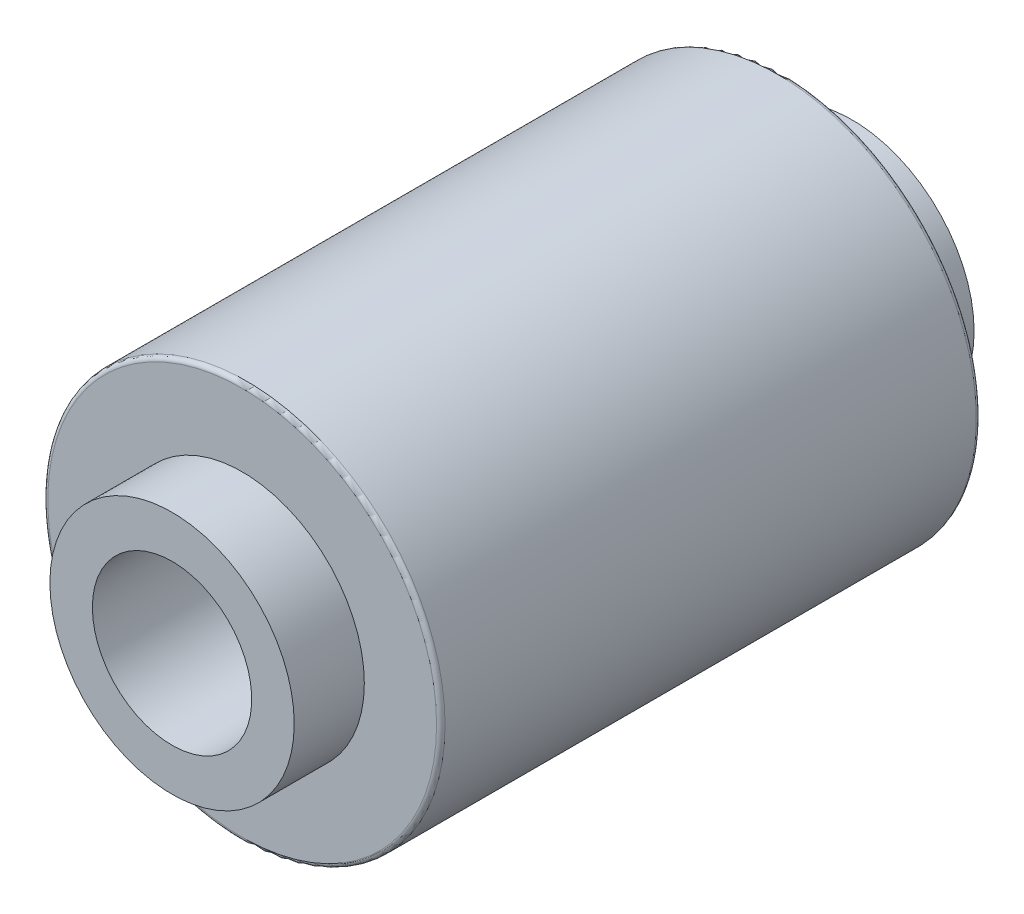
ISO-10303-21;
HEADER;
FILE_DESCRIPTION(('STEP AP214'),'2;1');
FILE_NAME('part.step','',(''),(''),'','','');
FILE_SCHEMA(('AUTOMOTIVE_DESIGN { 1 0 10303 214 1 1 1 1 }'));
ENDSEC;
DATA;
#1=APPLICATION_CONTEXT('core data for automotive mechanical design processes');
#2=APPLICATION_PROTOCOL_DEFINITION('international standard','automotive_design',2000,#1);
#3=PRODUCT_CONTEXT('',#1,'mechanical');
#4=PRODUCT('Part','Part','',(#3));
#5=PRODUCT_RELATED_PRODUCT_CATEGORY('part','',(#4));
#6=PRODUCT_DEFINITION_FORMATION('','',#4);
#7=PRODUCT_DEFINITION_CONTEXT('part definition',#1,'design');
#8=PRODUCT_DEFINITION('design','',#6,#7);
#9=PRODUCT_DEFINITION_SHAPE('','',#8);
#10=(LENGTH_UNIT() NAMED_UNIT(*) SI_UNIT(.MILLI.,.METRE.));
#11=(NAMED_UNIT(*) PLANE_ANGLE_UNIT() SI_UNIT($,.RADIAN.));
#12=(NAMED_UNIT(*) SI_UNIT($,.STERADIAN.) SOLID_ANGLE_UNIT());
#13=UNCERTAINTY_MEASURE_WITH_UNIT(LENGTH_MEASURE(1.E-05),#10,'distance_accuracy_value','');
#14=(GEOMETRIC_REPRESENTATION_CONTEXT(3) GLOBAL_UNCERTAINTY_ASSIGNED_CONTEXT((#13)) GLOBAL_UNIT_ASSIGNED_CONTEXT((#10,
#11,#12)) REPRESENTATION_CONTEXT('',''));
#15=CARTESIAN_POINT('',(0.,0.,0.));
#16=DIRECTION('',(0.,0.,1.));
#17=DIRECTION('',(1.,0.,0.));
#18=AXIS2_PLACEMENT_3D('',#15,#16,#17);
#19=CARTESIAN_POINT('',(29.464,-10.2235,20.32));
#20=DIRECTION('',(0.,0.,1.));
#21=DIRECTION('',(1.,0.,0.));
#22=AXIS2_PLACEMENT_3D('',#19,#20,#21);
#23=PLANE('',#22);
#24=CARTESIAN_POINT('',(29.464,-17.526,20.32));
#25=DIRECTION('',(0.,0.,-1.));
#26=DIRECTION('',(-1.,0.,0.));
#27=AXIS2_PLACEMENT_3D('',#24,#25,#26);
#28=CIRCLE('',#27,4.7625);
#29=CARTESIAN_POINT('',(24.7015,-17.526,20.32));
#30=VERTEX_POINT('',#29);
#31=EDGE_CURVE('E77',#30,#30,#28,.T.);
#32=ORIENTED_EDGE('',*,*,#31,.T.);
#33=EDGE_LOOP('',(#32));
#34=FACE_BOUND('',#33,.T.);
#35=CARTESIAN_POINT('',(29.464,-17.526,20.32));
#36=DIRECTION('',(0.,0.,-1.));
#37=DIRECTION('',(-1.,0.,0.));
#38=AXIS2_PLACEMENT_3D('',#35,#36,#37);
#39=CIRCLE('',#38,7.3025);
#40=CARTESIAN_POINT('',(22.1615,-17.526,20.32));
#41=VERTEX_POINT('',#40);
#42=EDGE_CURVE('E61',#41,#41,#39,.T.);
#43=ORIENTED_EDGE('',*,*,#42,.F.);
#44=EDGE_LOOP('',(#43));
#45=FACE_BOUND('',#44,.T.);
#46=ADVANCED_FACE('F47',(#34,#45),#23,.T.);
#47=CARTESIAN_POINT('',(29.464,-5.6515,16.129));
#48=DIRECTION('',(0.,0.,1.));
#49=DIRECTION('',(1.,0.,0.));
#50=AXIS2_PLACEMENT_3D('',#47,#48,#49);
#51=PLANE('',#50);
#52=CARTESIAN_POINT('',(29.464,-17.526,16.129));
#53=DIRECTION('',(0.,0.,-1.));
#54=DIRECTION('',(-1.,0.,0.));
#55=AXIS2_PLACEMENT_3D('',#52,#53,#54);
#56=CIRCLE('',#55,7.3025);
#57=CARTESIAN_POINT('',(22.1615,-17.526,16.129));
#58=VERTEX_POINT('',#57);
#59=EDGE_CURVE('E68',#58,#58,#56,.T.);
#60=ORIENTED_EDGE('',*,*,#59,.T.);
#61=EDGE_LOOP('',(#60));
#62=FACE_BOUND('',#61,.T.);
#63=CARTESIAN_POINT('',(29.464,-17.526,16.129));
#64=DIRECTION('',(0.,0.,1.));
#65=DIRECTION('',(1.,0.,0.));
#66=AXIS2_PLACEMENT_3D('',#63,#64,#65);
#67=CIRCLE('',#66,11.6205);
#68=CARTESIAN_POINT('',(41.0845,-17.526,16.129));
#69=VERTEX_POINT('',#68);
#70=EDGE_CURVE('E92',#69,#69,#67,.T.);
#71=ORIENTED_EDGE('',*,*,#70,.T.);
#72=EDGE_LOOP('',(#71));
#73=FACE_BOUND('',#72,.T.);
#74=ADVANCED_FACE('F99',(#62,#73),#51,.T.);
#75=CARTESIAN_POINT('',(29.464,-5.6515,-16.129));
#76=DIRECTION('',(0.,0.,-1.));
#77=DIRECTION('',(0.,-1.,0.));
#78=AXIS2_PLACEMENT_3D('',#75,#76,#77);
#79=PLANE('',#78);
#80=CARTESIAN_POINT('',(29.464,-17.526,-16.129));
#81=DIRECTION('',(0.,0.,-1.));
#82=DIRECTION('',(-1.,0.,0.));
#83=AXIS2_PLACEMENT_3D('',#80,#81,#82);
#84=CIRCLE('',#83,7.3025);
#85=CARTESIAN_POINT('',(22.1615,-17.526,-16.129));
#86=VERTEX_POINT('',#85);
#87=EDGE_CURVE('E10',#86,#86,#84,.T.);
#88=ORIENTED_EDGE('',*,*,#87,.F.);
#89=EDGE_LOOP('',(#88));
#90=FACE_BOUND('',#89,.T.);
#91=CARTESIAN_POINT('',(29.464,-17.526,-16.129));
#92=DIRECTION('',(0.,0.,-1.));
#93=DIRECTION('',(-1.,0.,0.));
#94=AXIS2_PLACEMENT_3D('',#91,#92,#93);
#95=CIRCLE('',#94,11.6205);
#96=CARTESIAN_POINT('',(17.8435,-17.526,-16.129));
#97=VERTEX_POINT('',#96);
#98=EDGE_CURVE('E85',#97,#97,#95,.T.);
#99=ORIENTED_EDGE('',*,*,#98,.T.);
#100=EDGE_LOOP('',(#99));
#101=FACE_BOUND('',#100,.T.);
#102=ADVANCED_FACE('F120',(#90,#101),#79,.T.);
#103=CARTESIAN_POINT('',(29.464,-10.2235,-20.32));
#104=DIRECTION('',(0.,0.,-1.));
#105=DIRECTION('',(0.,-1.,0.));
#106=AXIS2_PLACEMENT_3D('',#103,#104,#105);
#107=PLANE('',#106);
#108=CARTESIAN_POINT('',(29.464,-17.526,-20.32));
#109=DIRECTION('',(0.,0.,-1.));
#110=DIRECTION('',(-1.,0.,0.));
#111=AXIS2_PLACEMENT_3D('',#108,#109,#110);
#112=CIRCLE('',#111,4.7625);
#113=CARTESIAN_POINT('',(24.7015,-17.526,-20.32));
#114=VERTEX_POINT('',#113);
#115=EDGE_CURVE('E73',#114,#114,#112,.T.);
#116=ORIENTED_EDGE('',*,*,#115,.F.);
#117=EDGE_LOOP('',(#116));
#118=FACE_BOUND('',#117,.T.);
#119=CARTESIAN_POINT('',(29.464,-17.526,-20.32));
#120=DIRECTION('',(0.,0.,-1.));
#121=DIRECTION('',(-1.,0.,0.));
#122=AXIS2_PLACEMENT_3D('',#119,#120,#121);
#123=CIRCLE('',#122,7.3025);
#124=CARTESIAN_POINT('',(22.1615,-17.526,-20.32));
#125=VERTEX_POINT('',#124);
#126=EDGE_CURVE('E54',#125,#125,#123,.T.);
#127=ORIENTED_EDGE('',*,*,#126,.T.);
#128=EDGE_LOOP('',(#127));
#129=FACE_BOUND('',#128,.T.);
#130=ADVANCED_FACE('F144',(#118,#129),#107,.T.);
#131=CARTESIAN_POINT('',(29.464,-17.526,0.));
#132=DIRECTION('',(0.,0.,-1.));
#133=DIRECTION('',(-1.,0.,0.));
#134=AXIS2_PLACEMENT_3D('',#131,#132,#133);
#135=CYLINDRICAL_SURFACE('',#134,7.3025);
#136=ORIENTED_EDGE('',*,*,#87,.T.);
#137=EDGE_LOOP('',(#136));
#138=FACE_BOUND('',#137,.T.);
#139=ORIENTED_EDGE('',*,*,#126,.F.);
#140=EDGE_LOOP('',(#139));
#141=FACE_BOUND('',#140,.T.);
#142=ADVANCED_FACE('F139',(#138,#141),#135,.T.);
#143=CARTESIAN_POINT('',(29.464,-17.526,0.));
#144=DIRECTION('',(0.,0.,-1.));
#145=DIRECTION('',(-1.,0.,0.));
#146=AXIS2_PLACEMENT_3D('',#143,#144,#145);
#147=CYLINDRICAL_SURFACE('',#146,11.8745);
#148=CARTESIAN_POINT('',(29.464,-17.526,15.875));
#149=DIRECTION('',(0.,0.,-1.));
#150=DIRECTION('',(1.,0.,0.));
#151=AXIS2_PLACEMENT_3D('',#148,#149,#150);
#152=CIRCLE('',#151,11.8745);
#153=CARTESIAN_POINT('',(41.3385,-17.526,15.875));
#154=VERTEX_POINT('',#153);
#155=EDGE_CURVE('E89',#154,#154,#152,.T.);
#156=ORIENTED_EDGE('',*,*,#155,.T.);
#157=EDGE_LOOP('',(#156));
#158=FACE_BOUND('',#157,.T.);
#159=CARTESIAN_POINT('',(29.464,-17.526,-15.875));
#160=DIRECTION('',(0.,0.,1.));
#161=DIRECTION('',(-1.,0.,0.));
#162=AXIS2_PLACEMENT_3D('',#159,#160,#161);
#163=CIRCLE('',#162,11.8745);
#164=CARTESIAN_POINT('',(17.5895,-17.526,-15.875));
#165=VERTEX_POINT('',#164);
#166=EDGE_CURVE('E81',#165,#165,#163,.T.);
#167=ORIENTED_EDGE('',*,*,#166,.T.);
#168=EDGE_LOOP('',(#167));
#169=FACE_BOUND('',#168,.T.);
#170=ADVANCED_FACE('F129',(#158,#169),#147,.T.);
#171=CARTESIAN_POINT('',(29.464,-17.526,0.));
#172=DIRECTION('',(0.,0.,-1.));
#173=DIRECTION('',(-1.,0.,0.));
#174=AXIS2_PLACEMENT_3D('',#171,#172,#173);
#175=CYLINDRICAL_SURFACE('',#174,7.3025);
#176=ORIENTED_EDGE('',*,*,#42,.T.);
#177=EDGE_LOOP('',(#176));
#178=FACE_BOUND('',#177,.T.);
#179=ORIENTED_EDGE('',*,*,#59,.F.);
#180=EDGE_LOOP('',(#179));
#181=FACE_BOUND('',#180,.T.);
#182=ADVANCED_FACE('F126',(#178,#181),#175,.T.);
#183=CARTESIAN_POINT('',(29.464,-17.526,0.));
#184=DIRECTION('',(0.,0.,-1.));
#185=DIRECTION('',(-1.,0.,0.));
#186=AXIS2_PLACEMENT_3D('',#183,#184,#185);
#187=CYLINDRICAL_SURFACE('',#186,4.7625);
#188=ORIENTED_EDGE('',*,*,#115,.T.);
#189=EDGE_LOOP('',(#188));
#190=FACE_BOUND('',#189,.T.);
#191=ORIENTED_EDGE('',*,*,#31,.F.);
#192=EDGE_LOOP('',(#191));
#193=FACE_BOUND('',#192,.T.);
#194=ADVANCED_FACE('F110',(#190,#193),#187,.F.);
#195=CARTESIAN_POINT('',(29.464,-17.526,-15.875));
#196=DIRECTION('',(0.,0.,-1.));
#197=DIRECTION('',(-1.,0.,0.));
#198=AXIS2_PLACEMENT_3D('',#195,#196,#197);
#199=TOROIDAL_SURFACE('',#198,11.6205,0.254);
#200=ORIENTED_EDGE('',*,*,#166,.F.);
#201=EDGE_LOOP('',(#200));
#202=FACE_BOUND('',#201,.T.);
#203=ORIENTED_EDGE('',*,*,#98,.F.);
#204=EDGE_LOOP('',(#203));
#205=FACE_BOUND('',#204,.T.);
#206=ADVANCED_FACE('F103',(#202,#205),#199,.T.);
#207=CARTESIAN_POINT('',(29.464,-17.526,15.875));
#208=DIRECTION('',(0.,0.,1.));
#209=DIRECTION('',(1.,0.,0.));
#210=AXIS2_PLACEMENT_3D('',#207,#208,#209);
#211=TOROIDAL_SURFACE('',#210,11.6205,0.254);
#212=ORIENTED_EDGE('',*,*,#155,.F.);
#213=EDGE_LOOP('',(#212));
#214=FACE_BOUND('',#213,.T.);
#215=ORIENTED_EDGE('',*,*,#70,.F.);
#216=EDGE_LOOP('',(#215));
#217=FACE_BOUND('',#216,.T.);
#218=ADVANCED_FACE('F101',(#214,#217),#211,.T.);
#219=CLOSED_SHELL('',(#46,#74,#102,#130,#142,#170,#182,#194,#206,#218));
#220=MANIFOLD_SOLID_BREP('B2',#219);
#221=ADVANCED_BREP_SHAPE_REPRESENTATION('',(#18,#220),#14);
#222=SHAPE_DEFINITION_REPRESENTATION(#9,#221);
ENDSEC;
END-ISO-10303-21;
